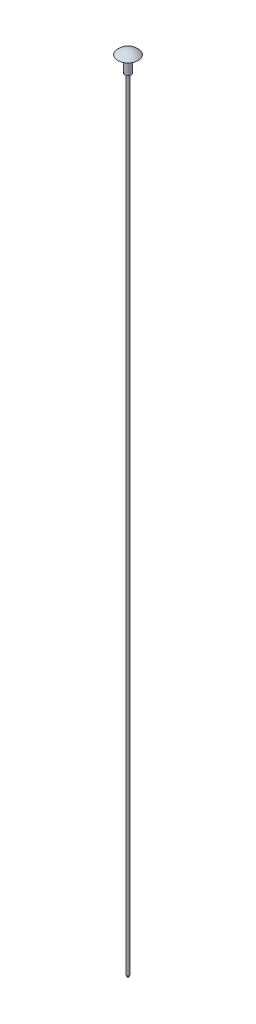
ISO-10303-21;
HEADER;
FILE_DESCRIPTION(('STEP AP214'),'2;1');
FILE_NAME('part.step','',(''),(''),'','','');
FILE_SCHEMA(('AUTOMOTIVE_DESIGN { 1 0 10303 214 1 1 1 1 }'));
ENDSEC;
DATA;
#1=APPLICATION_CONTEXT('core data for automotive mechanical design processes');
#2=APPLICATION_PROTOCOL_DEFINITION('international standard','automotive_design',2000,#1);
#3=PRODUCT_CONTEXT('',#1,'mechanical');
#4=PRODUCT('Part','Part','',(#3));
#5=PRODUCT_RELATED_PRODUCT_CATEGORY('part','',(#4));
#6=PRODUCT_DEFINITION_FORMATION('','',#4);
#7=PRODUCT_DEFINITION_CONTEXT('part definition',#1,'design');
#8=PRODUCT_DEFINITION('design','',#6,#7);
#9=PRODUCT_DEFINITION_SHAPE('','',#8);
#10=(LENGTH_UNIT() NAMED_UNIT(*) SI_UNIT(.MILLI.,.METRE.));
#11=(NAMED_UNIT(*) PLANE_ANGLE_UNIT() SI_UNIT($,.RADIAN.));
#12=(NAMED_UNIT(*) SI_UNIT($,.STERADIAN.) SOLID_ANGLE_UNIT());
#13=UNCERTAINTY_MEASURE_WITH_UNIT(LENGTH_MEASURE(1.E-05),#10,'distance_accuracy_value','');
#14=(GEOMETRIC_REPRESENTATION_CONTEXT(3) GLOBAL_UNCERTAINTY_ASSIGNED_CONTEXT((#13)) GLOBAL_UNIT_ASSIGNED_CONTEXT((#10,
#11,#12)) REPRESENTATION_CONTEXT('',''));
#15=CARTESIAN_POINT('',(0.,0.,0.));
#16=DIRECTION('',(0.,0.,1.));
#17=DIRECTION('',(1.,0.,0.));
#18=AXIS2_PLACEMENT_3D('',#15,#16,#17);
#19=CARTESIAN_POINT('',(-5.,1300.,0.));
#20=DIRECTION('',(0.,1.,0.));
#21=DIRECTION('',(0.,0.,1.));
#22=AXIS2_PLACEMENT_3D('',#19,#20,#21);
#23=PLANE('',#22);
#24=CARTESIAN_POINT('',(0.,1300.,0.));
#25=DIRECTION('',(0.,-1.,0.));
#26=DIRECTION('',(0.,0.,-1.));
#27=AXIS2_PLACEMENT_3D('',#24,#25,#26);
#28=CIRCLE('',#27,5.);
#29=CARTESIAN_POINT('',(0.,1300.,-5.));
#30=VERTEX_POINT('',#29);
#31=EDGE_CURVE('E55',#30,#30,#28,.T.);
#32=ORIENTED_EDGE('',*,*,#31,.F.);
#33=EDGE_LOOP('',(#32));
#34=FACE_BOUND('',#33,.T.);
#35=CARTESIAN_POINT('',(0.,1300.,0.));
#36=DIRECTION('',(0.,-1.,0.));
#37=DIRECTION('',(0.,0.,-1.));
#38=AXIS2_PLACEMENT_3D('',#35,#36,#37);
#39=CIRCLE('',#38,10.7784293699733);
#40=CARTESIAN_POINT('',(0.,1300.,-10.7784293699733));
#41=VERTEX_POINT('',#40);
#42=EDGE_CURVE('E11',#41,#41,#39,.T.);
#43=ORIENTED_EDGE('',*,*,#42,.T.);
#44=EDGE_LOOP('',(#43));
#45=FACE_BOUND('',#44,.T.);
#46=ADVANCED_FACE('F35',(#34,#45),#23,.F.);
#47=CARTESIAN_POINT('',(0.,1300.,0.));
#48=DIRECTION('',(0.,-1.,0.));
#49=DIRECTION('',(0.,0.,-1.));
#50=AXIS2_PLACEMENT_3D('',#47,#48,#49);
#51=CYLINDRICAL_SURFACE('',#50,10.7784293699733);
#52=ORIENTED_EDGE('',*,*,#42,.F.);
#53=EDGE_LOOP('',(#52));
#54=FACE_BOUND('',#53,.T.);
#55=CARTESIAN_POINT('',(0.,1352.88765497768,0.));
#56=DIRECTION('',(0.,-1.,0.));
#57=DIRECTION('',(0.,0.,-1.));
#58=AXIS2_PLACEMENT_3D('',#55,#56,#57);
#59=CIRCLE('',#58,10.7784293699733);
#60=CARTESIAN_POINT('',(0.,1352.88765497768,-10.7784293699733));
#61=VERTEX_POINT('',#60);
#62=EDGE_CURVE('E41',#61,#61,#59,.T.);
#63=ORIENTED_EDGE('',*,*,#62,.T.);
#64=EDGE_LOOP('',(#63));
#65=FACE_BOUND('',#64,.T.);
#66=ADVANCED_FACE('F64',(#54,#65),#51,.T.);
#67=CARTESIAN_POINT('',(-10.7784293699733,1352.88765497768,0.));
#68=DIRECTION('',(0.,1.,0.));
#69=DIRECTION('',(0.,0.,1.));
#70=AXIS2_PLACEMENT_3D('',#67,#68,#69);
#71=PLANE('',#70);
#72=ORIENTED_EDGE('',*,*,#62,.F.);
#73=EDGE_LOOP('',(#72));
#74=FACE_BOUND('',#73,.T.);
#75=CARTESIAN_POINT('',(0.,1352.88765497768,0.));
#76=DIRECTION('',(0.,-1.,0.));
#77=DIRECTION('',(0.,0.,-1.));
#78=AXIS2_PLACEMENT_3D('',#75,#76,#77);
#79=CIRCLE('',#78,33.7761377171716);
#80=CARTESIAN_POINT('',(0.,1352.88765497768,-33.7761377171716));
#81=VERTEX_POINT('',#80);
#82=EDGE_CURVE('E54',#81,#81,#79,.T.);
#83=ORIENTED_EDGE('',*,*,#82,.T.);
#84=EDGE_LOOP('',(#83));
#85=FACE_BOUND('',#84,.T.);
#86=ADVANCED_FACE('F66',(#74,#85),#71,.F.);
#87=CARTESIAN_POINT('',(0.,1321.02019283291,0.));
#88=DIRECTION('',(0.,-1.,0.));
#89=DIRECTION('',(-1.,0.,0.));
#90=AXIS2_PLACEMENT_3D('',#87,#88,#89);
#91=SPHERICAL_SURFACE('',#90,46.4366517164798);
#92=ORIENTED_EDGE('',*,*,#82,.F.);
#93=EDGE_LOOP('',(#92));
#94=FACE_BOUND('',#93,.T.);
#95=ADVANCED_FACE('F48',(#94),#91,.T.);
#96=CARTESIAN_POINT('',(0.,-1291.33974596216,0.));
#97=DIRECTION('',(0.,1.,0.));
#98=DIRECTION('',(0.,0.,1.));
#99=AXIS2_PLACEMENT_3D('',#96,#97,#98);
#100=CONICAL_SURFACE('',#99,4.99999999999968,0.523598775598291);
#101=CARTESIAN_POINT('',(0.,-1300.,0.));
#102=VERTEX_POINT('',#101);
#103=VERTEX_LOOP('',#102);
#104=FACE_BOUND('',#103,.T.);
#105=CARTESIAN_POINT('',(0.,-1291.33974596216,0.));
#106=DIRECTION('',(0.,-1.,0.));
#107=DIRECTION('',(0.,0.,-1.));
#108=AXIS2_PLACEMENT_3D('',#105,#106,#107);
#109=CIRCLE('',#108,4.99999999999968);
#110=CARTESIAN_POINT('',(0.,-1291.33974596216,-4.99999999999968));
#111=VERTEX_POINT('',#110);
#112=EDGE_CURVE('E52',#111,#111,#109,.T.);
#113=ORIENTED_EDGE('',*,*,#112,.T.);
#114=EDGE_LOOP('',(#113));
#115=FACE_BOUND('',#114,.T.);
#116=ADVANCED_FACE('F44',(#104,#115),#100,.T.);
#117=CARTESIAN_POINT('',(0.,1300.,0.));
#118=DIRECTION('',(0.,-1.,0.));
#119=DIRECTION('',(0.,0.,-1.));
#120=AXIS2_PLACEMENT_3D('',#117,#118,#119);
#121=CYLINDRICAL_SURFACE('',#120,4.99999999999984);
#122=ORIENTED_EDGE('',*,*,#112,.F.);
#123=EDGE_LOOP('',(#122));
#124=FACE_BOUND('',#123,.T.);
#125=ORIENTED_EDGE('',*,*,#31,.T.);
#126=EDGE_LOOP('',(#125));
#127=FACE_BOUND('',#126,.T.);
#128=ADVANCED_FACE('F47',(#124,#127),#121,.T.);
#129=CLOSED_SHELL('',(#46,#66,#86,#95,#116,#128));
#130=MANIFOLD_SOLID_BREP('B2',#129);
#131=ADVANCED_BREP_SHAPE_REPRESENTATION('',(#18,#130),#14);
#132=SHAPE_DEFINITION_REPRESENTATION(#9,#131);
ENDSEC;
END-ISO-10303-21;
